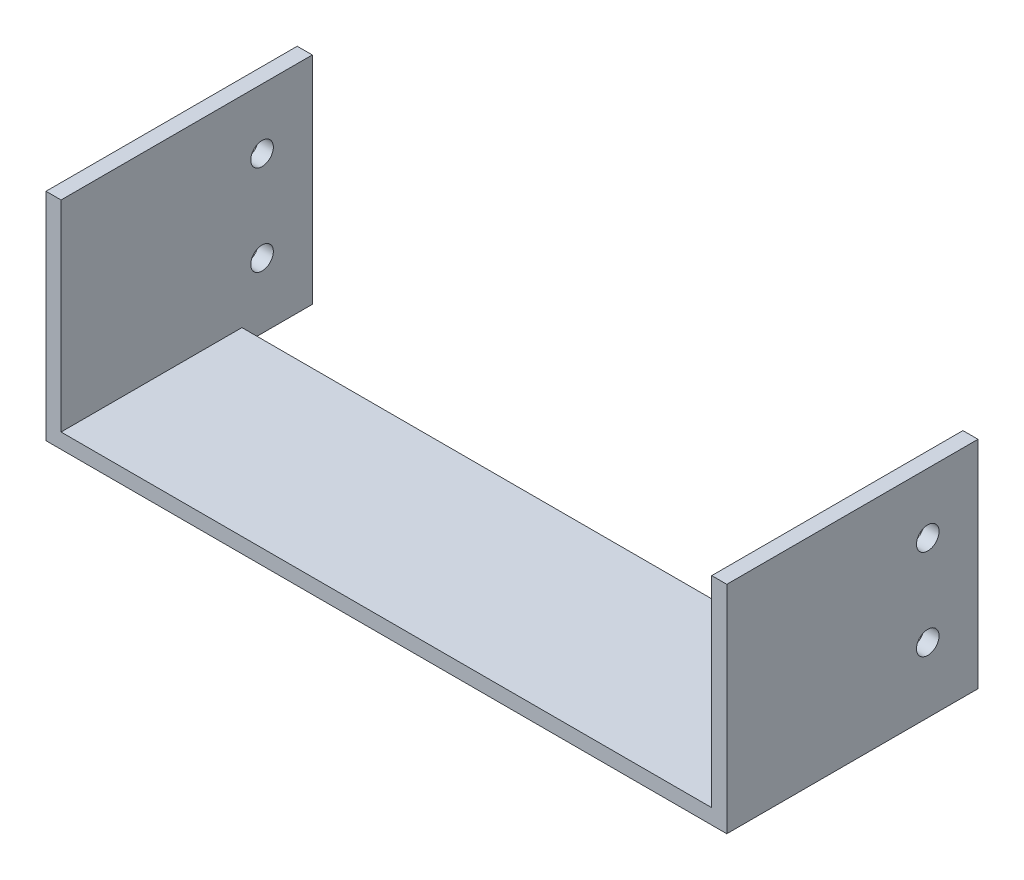
ISO-10303-21;
HEADER;
FILE_DESCRIPTION(('STEP AP214'),'2;1');
FILE_NAME('part.step','',(''),(''),'','','');
FILE_SCHEMA(('AUTOMOTIVE_DESIGN { 1 0 10303 214 1 1 1 1 }'));
ENDSEC;
DATA;
#1=APPLICATION_CONTEXT('core data for automotive mechanical design processes');
#2=APPLICATION_PROTOCOL_DEFINITION('international standard','automotive_design',2000,#1);
#3=PRODUCT_CONTEXT('',#1,'mechanical');
#4=PRODUCT('Part','Part','',(#3));
#5=PRODUCT_RELATED_PRODUCT_CATEGORY('part','',(#4));
#6=PRODUCT_DEFINITION_FORMATION('','',#4);
#7=PRODUCT_DEFINITION_CONTEXT('part definition',#1,'design');
#8=PRODUCT_DEFINITION('design','',#6,#7);
#9=PRODUCT_DEFINITION_SHAPE('','',#8);
#10=(LENGTH_UNIT() NAMED_UNIT(*) SI_UNIT(.MILLI.,.METRE.));
#11=(NAMED_UNIT(*) PLANE_ANGLE_UNIT() SI_UNIT($,.RADIAN.));
#12=(NAMED_UNIT(*) SI_UNIT($,.STERADIAN.) SOLID_ANGLE_UNIT());
#13=UNCERTAINTY_MEASURE_WITH_UNIT(LENGTH_MEASURE(1.E-05),#10,'distance_accuracy_value','');
#14=(GEOMETRIC_REPRESENTATION_CONTEXT(3) GLOBAL_UNCERTAINTY_ASSIGNED_CONTEXT((#13)) GLOBAL_UNIT_ASSIGNED_CONTEXT((#10,
#11,#12)) REPRESENTATION_CONTEXT('',''));
#15=CARTESIAN_POINT('',(0.,0.,0.));
#16=DIRECTION('',(0.,0.,1.));
#17=DIRECTION('',(1.,0.,0.));
#18=AXIS2_PLACEMENT_3D('',#15,#16,#17);
#19=CARTESIAN_POINT('',(129.5,3.,0.));
#20=DIRECTION('',(0.,0.,-1.));
#21=DIRECTION('',(-1.,0.,0.));
#22=AXIS2_PLACEMENT_3D('',#19,#20,#21);
#23=PLANE('',#22);
#24=DIRECTION('',(1.,0.,0.));
#25=VECTOR('',#24,1.);
#26=CARTESIAN_POINT('',(129.5,0.,0.));
#27=LINE('',#26,#25);
#28=CARTESIAN_POINT('',(-3.,0.,0.));
#29=VERTEX_POINT('',#28);
#30=CARTESIAN_POINT('',(132.5,0.,0.));
#31=VERTEX_POINT('',#30);
#32=EDGE_CURVE('E113',#29,#31,#27,.T.);
#33=ORIENTED_EDGE('',*,*,#32,.T.);
#34=DIRECTION('',(0.,-1.,0.));
#35=VECTOR('',#34,1.);
#36=CARTESIAN_POINT('',(132.5,0.,0.));
#37=LINE('',#36,#35);
#38=CARTESIAN_POINT('',(132.5,43.,0.));
#39=VERTEX_POINT('',#38);
#40=EDGE_CURVE('E182',#39,#31,#37,.T.);
#41=ORIENTED_EDGE('',*,*,#40,.F.);
#42=DIRECTION('',(-1.,0.,0.));
#43=VECTOR('',#42,1.);
#44=CARTESIAN_POINT('',(132.5,43.,0.));
#45=LINE('',#44,#43);
#46=CARTESIAN_POINT('',(129.5,43.,0.));
#47=VERTEX_POINT('',#46);
#48=EDGE_CURVE('E184',#39,#47,#45,.T.);
#49=ORIENTED_EDGE('',*,*,#48,.T.);
#50=DIRECTION('',(0.,-1.,0.));
#51=VECTOR('',#50,1.);
#52=CARTESIAN_POINT('',(129.5,0.,0.));
#53=LINE('',#52,#51);
#54=CARTESIAN_POINT('',(129.5,3.,0.));
#55=VERTEX_POINT('',#54);
#56=EDGE_CURVE('E178',#47,#55,#53,.T.);
#57=ORIENTED_EDGE('',*,*,#56,.T.);
#58=DIRECTION('',(1.,0.,0.));
#59=VECTOR('',#58,1.);
#60=CARTESIAN_POINT('',(129.5,3.,0.));
#61=LINE('',#60,#59);
#62=CARTESIAN_POINT('',(0.,3.,0.));
#63=VERTEX_POINT('',#62);
#64=EDGE_CURVE('E199',#63,#55,#61,.T.);
#65=ORIENTED_EDGE('',*,*,#64,.F.);
#66=DIRECTION('',(0.,-1.,0.));
#67=VECTOR('',#66,1.);
#68=CARTESIAN_POINT('',(0.,0.,0.));
#69=LINE('',#68,#67);
#70=CARTESIAN_POINT('',(0.,43.,0.));
#71=VERTEX_POINT('',#70);
#72=EDGE_CURVE('E150',#71,#63,#69,.T.);
#73=ORIENTED_EDGE('',*,*,#72,.F.);
#74=DIRECTION('',(1.,0.,0.));
#75=VECTOR('',#74,1.);
#76=CARTESIAN_POINT('',(-3.,43.,0.));
#77=LINE('',#76,#75);
#78=CARTESIAN_POINT('',(-3.,43.,0.));
#79=VERTEX_POINT('',#78);
#80=EDGE_CURVE('E140',#79,#71,#77,.T.);
#81=ORIENTED_EDGE('',*,*,#80,.F.);
#82=DIRECTION('',(0.,-1.,0.));
#83=VECTOR('',#82,1.);
#84=CARTESIAN_POINT('',(-3.,0.,0.));
#85=LINE('',#84,#83);
#86=EDGE_CURVE('E133',#79,#29,#85,.T.);
#87=ORIENTED_EDGE('',*,*,#86,.T.);
#88=EDGE_LOOP('',(#33,#41,#49,#57,#65,#73,#81,#87));
#89=FACE_BOUND('',#88,.T.);
#90=ADVANCED_FACE('F36',(#89),#23,.F.);
#91=CARTESIAN_POINT('',(0.,3.,-36.));
#92=DIRECTION('',(0.,0.,1.));
#93=DIRECTION('',(1.,0.,0.));
#94=AXIS2_PLACEMENT_3D('',#91,#92,#93);
#95=PLANE('',#94);
#96=DIRECTION('',(-1.,0.,0.));
#97=VECTOR('',#96,1.);
#98=CARTESIAN_POINT('',(0.,0.,-36.));
#99=LINE('',#98,#97);
#100=CARTESIAN_POINT('',(129.5,0.,-36.));
#101=VERTEX_POINT('',#100);
#102=CARTESIAN_POINT('',(0.,0.,-36.));
#103=VERTEX_POINT('',#102);
#104=EDGE_CURVE('E126',#101,#103,#99,.T.);
#105=ORIENTED_EDGE('',*,*,#104,.T.);
#106=DIRECTION('',(0.,-1.,0.));
#107=VECTOR('',#106,1.);
#108=CARTESIAN_POINT('',(0.,3.,-36.));
#109=LINE('',#108,#107);
#110=CARTESIAN_POINT('',(0.,3.,-36.));
#111=VERTEX_POINT('',#110);
#112=EDGE_CURVE('E43',#111,#103,#109,.T.);
#113=ORIENTED_EDGE('',*,*,#112,.F.);
#114=DIRECTION('',(-1.,0.,0.));
#115=VECTOR('',#114,1.);
#116=CARTESIAN_POINT('',(0.,3.,-36.));
#117=LINE('',#116,#115);
#118=CARTESIAN_POINT('',(129.5,3.,-36.));
#119=VERTEX_POINT('',#118);
#120=EDGE_CURVE('E55',#119,#111,#117,.T.);
#121=ORIENTED_EDGE('',*,*,#120,.F.);
#122=DIRECTION('',(0.,-1.,0.));
#123=VECTOR('',#122,1.);
#124=CARTESIAN_POINT('',(129.5,3.,-36.));
#125=LINE('',#124,#123);
#126=EDGE_CURVE('E11',#119,#101,#125,.T.);
#127=ORIENTED_EDGE('',*,*,#126,.T.);
#128=EDGE_LOOP('',(#105,#113,#121,#127));
#129=FACE_BOUND('',#128,.T.);
#130=ADVANCED_FACE('F220',(#129),#95,.F.);
#131=CARTESIAN_POINT('',(0.,3.,0.));
#132=DIRECTION('',(0.,-1.,0.));
#133=DIRECTION('',(0.,0.,-1.));
#134=AXIS2_PLACEMENT_3D('',#131,#132,#133);
#135=PLANE('',#134);
#136=ORIENTED_EDGE('',*,*,#64,.T.);
#137=DIRECTION('',(0.,0.,-1.));
#138=VECTOR('',#137,1.);
#139=CARTESIAN_POINT('',(129.5,3.,-36.));
#140=LINE('',#139,#138);
#141=EDGE_CURVE('E201',#55,#119,#140,.T.);
#142=ORIENTED_EDGE('',*,*,#141,.T.);
#143=ORIENTED_EDGE('',*,*,#120,.T.);
#144=DIRECTION('',(0.,0.,1.));
#145=VECTOR('',#144,1.);
#146=CARTESIAN_POINT('',(0.,3.,0.));
#147=LINE('',#146,#145);
#148=EDGE_CURVE('E50',#111,#63,#147,.T.);
#149=ORIENTED_EDGE('',*,*,#148,.T.);
#150=EDGE_LOOP('',(#136,#142,#143,#149));
#151=FACE_BOUND('',#150,.T.);
#152=ADVANCED_FACE('F218',(#151),#135,.F.);
#153=CARTESIAN_POINT('',(0.,0.,0.));
#154=DIRECTION('',(0.,-1.,0.));
#155=DIRECTION('',(0.,0.,-1.));
#156=AXIS2_PLACEMENT_3D('',#153,#154,#155);
#157=PLANE('',#156);
#158=ORIENTED_EDGE('',*,*,#32,.F.);
#159=DIRECTION('',(0.,0.,-1.));
#160=VECTOR('',#159,1.);
#161=CARTESIAN_POINT('',(-3.,0.,0.));
#162=LINE('',#161,#160);
#163=CARTESIAN_POINT('',(-3.,0.,-50.));
#164=VERTEX_POINT('',#163);
#165=EDGE_CURVE('E117',#29,#164,#162,.T.);
#166=ORIENTED_EDGE('',*,*,#165,.T.);
#167=DIRECTION('',(1.,0.,0.));
#168=VECTOR('',#167,1.);
#169=CARTESIAN_POINT('',(-3.,0.,-50.));
#170=LINE('',#169,#168);
#171=CARTESIAN_POINT('',(0.,0.,-50.));
#172=VERTEX_POINT('',#171);
#173=EDGE_CURVE('E147',#164,#172,#170,.T.);
#174=ORIENTED_EDGE('',*,*,#173,.T.);
#175=DIRECTION('',(0.,0.,-1.));
#176=VECTOR('',#175,1.);
#177=CARTESIAN_POINT('',(0.,0.,0.));
#178=LINE('',#177,#176);
#179=EDGE_CURVE('E148',#103,#172,#178,.T.);
#180=ORIENTED_EDGE('',*,*,#179,.F.);
#181=ORIENTED_EDGE('',*,*,#104,.F.);
#182=DIRECTION('',(0.,0.,-1.));
#183=VECTOR('',#182,1.);
#184=CARTESIAN_POINT('',(129.5,0.,0.));
#185=LINE('',#184,#183);
#186=CARTESIAN_POINT('',(129.5,0.,-50.));
#187=VERTEX_POINT('',#186);
#188=EDGE_CURVE('E173',#101,#187,#185,.T.);
#189=ORIENTED_EDGE('',*,*,#188,.T.);
#190=DIRECTION('',(-1.,0.,0.));
#191=VECTOR('',#190,1.);
#192=CARTESIAN_POINT('',(132.5,0.,-50.));
#193=LINE('',#192,#191);
#194=CARTESIAN_POINT('',(132.5,0.,-50.));
#195=VERTEX_POINT('',#194);
#196=EDGE_CURVE('E127',#195,#187,#193,.T.);
#197=ORIENTED_EDGE('',*,*,#196,.F.);
#198=DIRECTION('',(0.,0.,-1.));
#199=VECTOR('',#198,1.);
#200=CARTESIAN_POINT('',(132.5,0.,0.));
#201=LINE('',#200,#199);
#202=EDGE_CURVE('E121',#31,#195,#201,.T.);
#203=ORIENTED_EDGE('',*,*,#202,.F.);
#204=EDGE_LOOP('',(#158,#166,#174,#180,#181,#189,#197,#203));
#205=FACE_BOUND('',#204,.T.);
#206=ADVANCED_FACE('F115',(#205),#157,.T.);
#207=CARTESIAN_POINT('',(129.5,0.,0.));
#208=DIRECTION('',(-1.,0.,0.));
#209=DIRECTION('',(0.,0.,1.));
#210=AXIS2_PLACEMENT_3D('',#207,#208,#209);
#211=PLANE('',#210);
#212=CARTESIAN_POINT('',(129.5,13.,-40.));
#213=DIRECTION('',(1.,0.,0.));
#214=DIRECTION('',(0.,0.,-1.));
#215=AXIS2_PLACEMENT_3D('',#212,#213,#214);
#216=CIRCLE('',#215,2.25);
#217=CARTESIAN_POINT('',(129.5,13.,-42.25));
#218=VERTEX_POINT('',#217);
#219=EDGE_CURVE('E163',#218,#218,#216,.T.);
#220=ORIENTED_EDGE('',*,*,#219,.T.);
#221=EDGE_LOOP('',(#220));
#222=FACE_BOUND('',#221,.T.);
#223=CARTESIAN_POINT('',(129.5,31.,-40.));
#224=DIRECTION('',(1.,0.,0.));
#225=DIRECTION('',(0.,0.,-1.));
#226=AXIS2_PLACEMENT_3D('',#223,#224,#225);
#227=CIRCLE('',#226,2.25);
#228=CARTESIAN_POINT('',(129.5,31.,-42.25));
#229=VERTEX_POINT('',#228);
#230=EDGE_CURVE('E167',#229,#229,#227,.T.);
#231=ORIENTED_EDGE('',*,*,#230,.T.);
#232=EDGE_LOOP('',(#231));
#233=FACE_BOUND('',#232,.T.);
#234=ORIENTED_EDGE('',*,*,#126,.F.);
#235=ORIENTED_EDGE('',*,*,#141,.F.);
#236=ORIENTED_EDGE('',*,*,#56,.F.);
#237=DIRECTION('',(0.,0.,1.));
#238=VECTOR('',#237,1.);
#239=CARTESIAN_POINT('',(129.5,43.,0.));
#240=LINE('',#239,#238);
#241=CARTESIAN_POINT('',(129.5,43.,-50.));
#242=VERTEX_POINT('',#241);
#243=EDGE_CURVE('E188',#242,#47,#240,.T.);
#244=ORIENTED_EDGE('',*,*,#243,.F.);
#245=DIRECTION('',(0.,1.,0.));
#246=VECTOR('',#245,1.);
#247=CARTESIAN_POINT('',(129.5,43.,-50.));
#248=LINE('',#247,#246);
#249=EDGE_CURVE('E186',#187,#242,#248,.T.);
#250=ORIENTED_EDGE('',*,*,#249,.F.);
#251=ORIENTED_EDGE('',*,*,#188,.F.);
#252=EDGE_LOOP('',(#234,#235,#236,#244,#250,#251));
#253=FACE_BOUND('',#252,.T.);
#254=ADVANCED_FACE('F221',(#222,#233,#253),#211,.T.);
#255=CARTESIAN_POINT('',(132.5,0.,0.));
#256=DIRECTION('',(-1.,0.,0.));
#257=DIRECTION('',(0.,0.,1.));
#258=AXIS2_PLACEMENT_3D('',#255,#256,#257);
#259=PLANE('',#258);
#260=ORIENTED_EDGE('',*,*,#202,.T.);
#261=DIRECTION('',(0.,1.,0.));
#262=VECTOR('',#261,1.);
#263=CARTESIAN_POINT('',(132.5,43.,-50.));
#264=LINE('',#263,#262);
#265=CARTESIAN_POINT('',(132.5,43.,-50.));
#266=VERTEX_POINT('',#265);
#267=EDGE_CURVE('E177',#195,#266,#264,.T.);
#268=ORIENTED_EDGE('',*,*,#267,.T.);
#269=DIRECTION('',(0.,0.,1.));
#270=VECTOR('',#269,1.);
#271=CARTESIAN_POINT('',(132.5,43.,0.));
#272=LINE('',#271,#270);
#273=EDGE_CURVE('E180',#266,#39,#272,.T.);
#274=ORIENTED_EDGE('',*,*,#273,.T.);
#275=ORIENTED_EDGE('',*,*,#40,.T.);
#276=EDGE_LOOP('',(#260,#268,#274,#275));
#277=FACE_BOUND('',#276,.T.);
#278=CARTESIAN_POINT('',(132.5,31.,-40.));
#279=DIRECTION('',(1.,0.,0.));
#280=DIRECTION('',(0.,0.,-1.));
#281=AXIS2_PLACEMENT_3D('',#278,#279,#280);
#282=CIRCLE('',#281,2.25);
#283=CARTESIAN_POINT('',(132.5,31.,-42.25));
#284=VERTEX_POINT('',#283);
#285=EDGE_CURVE('E170',#284,#284,#282,.T.);
#286=ORIENTED_EDGE('',*,*,#285,.F.);
#287=EDGE_LOOP('',(#286));
#288=FACE_BOUND('',#287,.T.);
#289=CARTESIAN_POINT('',(132.5,13.,-40.));
#290=DIRECTION('',(1.,0.,0.));
#291=DIRECTION('',(0.,0.,-1.));
#292=AXIS2_PLACEMENT_3D('',#289,#290,#291);
#293=CIRCLE('',#292,2.25);
#294=CARTESIAN_POINT('',(132.5,13.,-42.25));
#295=VERTEX_POINT('',#294);
#296=EDGE_CURVE('E164',#295,#295,#293,.T.);
#297=ORIENTED_EDGE('',*,*,#296,.F.);
#298=EDGE_LOOP('',(#297));
#299=FACE_BOUND('',#298,.T.);
#300=ADVANCED_FACE('F229',(#277,#288,#299),#259,.F.);
#301=CARTESIAN_POINT('',(132.5,43.,-50.));
#302=DIRECTION('',(0.,0.,1.));
#303=DIRECTION('',(0.,-1.,0.));
#304=AXIS2_PLACEMENT_3D('',#301,#302,#303);
#305=PLANE('',#304);
#306=ORIENTED_EDGE('',*,*,#249,.T.);
#307=DIRECTION('',(-1.,0.,0.));
#308=VECTOR('',#307,1.);
#309=CARTESIAN_POINT('',(132.5,43.,-50.));
#310=LINE('',#309,#308);
#311=EDGE_CURVE('E194',#266,#242,#310,.T.);
#312=ORIENTED_EDGE('',*,*,#311,.F.);
#313=ORIENTED_EDGE('',*,*,#267,.F.);
#314=ORIENTED_EDGE('',*,*,#196,.T.);
#315=EDGE_LOOP('',(#306,#312,#313,#314));
#316=FACE_BOUND('',#315,.T.);
#317=ADVANCED_FACE('F225',(#316),#305,.F.);
#318=CARTESIAN_POINT('',(132.5,43.,0.));
#319=DIRECTION('',(0.,-1.,0.));
#320=DIRECTION('',(0.,0.,-1.));
#321=AXIS2_PLACEMENT_3D('',#318,#319,#320);
#322=PLANE('',#321);
#323=ORIENTED_EDGE('',*,*,#243,.T.);
#324=ORIENTED_EDGE('',*,*,#48,.F.);
#325=ORIENTED_EDGE('',*,*,#273,.F.);
#326=ORIENTED_EDGE('',*,*,#311,.T.);
#327=EDGE_LOOP('',(#323,#324,#325,#326));
#328=FACE_BOUND('',#327,.T.);
#329=ADVANCED_FACE('F233',(#328),#322,.F.);
#330=CARTESIAN_POINT('',(132.5,31.,-40.));
#331=DIRECTION('',(-1.,0.,0.));
#332=DIRECTION('',(0.,0.,1.));
#333=AXIS2_PLACEMENT_3D('',#330,#331,#332);
#334=CYLINDRICAL_SURFACE('',#333,2.25);
#335=ORIENTED_EDGE('',*,*,#285,.T.);
#336=EDGE_LOOP('',(#335));
#337=FACE_BOUND('',#336,.T.);
#338=ORIENTED_EDGE('',*,*,#230,.F.);
#339=EDGE_LOOP('',(#338));
#340=FACE_BOUND('',#339,.T.);
#341=ADVANCED_FACE('F235',(#337,#340),#334,.F.);
#342=CARTESIAN_POINT('',(132.5,13.,-40.));
#343=DIRECTION('',(-1.,0.,0.));
#344=DIRECTION('',(0.,0.,1.));
#345=AXIS2_PLACEMENT_3D('',#342,#343,#344);
#346=CYLINDRICAL_SURFACE('',#345,2.25);
#347=ORIENTED_EDGE('',*,*,#296,.T.);
#348=EDGE_LOOP('',(#347));
#349=FACE_BOUND('',#348,.T.);
#350=ORIENTED_EDGE('',*,*,#219,.F.);
#351=EDGE_LOOP('',(#350));
#352=FACE_BOUND('',#351,.T.);
#353=ADVANCED_FACE('F241',(#349,#352),#346,.F.);
#354=CARTESIAN_POINT('',(0.,0.,0.));
#355=DIRECTION('',(1.,0.,0.));
#356=DIRECTION('',(0.,0.,1.));
#357=AXIS2_PLACEMENT_3D('',#354,#355,#356);
#358=PLANE('',#357);
#359=CARTESIAN_POINT('',(0.,31.,-40.));
#360=DIRECTION('',(1.,0.,0.));
#361=DIRECTION('',(0.,0.,-1.));
#362=AXIS2_PLACEMENT_3D('',#359,#360,#361);
#363=CIRCLE('',#362,2.25);
#364=CARTESIAN_POINT('',(0.,31.,-42.25));
#365=VERTEX_POINT('',#364);
#366=EDGE_CURVE('E297',#365,#365,#363,.T.);
#367=ORIENTED_EDGE('',*,*,#366,.F.);
#368=EDGE_LOOP('',(#367));
#369=FACE_BOUND('',#368,.T.);
#370=CARTESIAN_POINT('',(0.,13.,-40.));
#371=DIRECTION('',(1.,0.,0.));
#372=DIRECTION('',(0.,0.,-1.));
#373=AXIS2_PLACEMENT_3D('',#370,#371,#372);
#374=CIRCLE('',#373,2.25);
#375=CARTESIAN_POINT('',(0.,13.,-42.25));
#376=VERTEX_POINT('',#375);
#377=EDGE_CURVE('E294',#376,#376,#374,.T.);
#378=ORIENTED_EDGE('',*,*,#377,.F.);
#379=EDGE_LOOP('',(#378));
#380=FACE_BOUND('',#379,.T.);
#381=ORIENTED_EDGE('',*,*,#148,.F.);
#382=ORIENTED_EDGE('',*,*,#112,.T.);
#383=ORIENTED_EDGE('',*,*,#179,.T.);
#384=DIRECTION('',(0.,1.,0.));
#385=VECTOR('',#384,1.);
#386=CARTESIAN_POINT('',(0.,43.,-50.));
#387=LINE('',#386,#385);
#388=CARTESIAN_POINT('',(0.,43.,-50.));
#389=VERTEX_POINT('',#388);
#390=EDGE_CURVE('E137',#172,#389,#387,.T.);
#391=ORIENTED_EDGE('',*,*,#390,.T.);
#392=DIRECTION('',(0.,0.,1.));
#393=VECTOR('',#392,1.);
#394=CARTESIAN_POINT('',(0.,43.,0.));
#395=LINE('',#394,#393);
#396=EDGE_CURVE('E154',#389,#71,#395,.T.);
#397=ORIENTED_EDGE('',*,*,#396,.T.);
#398=ORIENTED_EDGE('',*,*,#72,.T.);
#399=EDGE_LOOP('',(#381,#382,#383,#391,#397,#398));
#400=FACE_BOUND('',#399,.T.);
#401=ADVANCED_FACE('F208',(#369,#380,#400),#358,.T.);
#402=CARTESIAN_POINT('',(-3.,43.,0.));
#403=DIRECTION('',(0.,1.,0.));
#404=DIRECTION('',(0.,0.,1.));
#405=AXIS2_PLACEMENT_3D('',#402,#403,#404);
#406=PLANE('',#405);
#407=ORIENTED_EDGE('',*,*,#396,.F.);
#408=DIRECTION('',(1.,0.,0.));
#409=VECTOR('',#408,1.);
#410=CARTESIAN_POINT('',(-3.,43.,-50.));
#411=LINE('',#410,#409);
#412=CARTESIAN_POINT('',(-3.,43.,-50.));
#413=VERTEX_POINT('',#412);
#414=EDGE_CURVE('E160',#413,#389,#411,.T.);
#415=ORIENTED_EDGE('',*,*,#414,.F.);
#416=DIRECTION('',(0.,0.,1.));
#417=VECTOR('',#416,1.);
#418=CARTESIAN_POINT('',(-3.,43.,0.));
#419=LINE('',#418,#417);
#420=EDGE_CURVE('E141',#413,#79,#419,.T.);
#421=ORIENTED_EDGE('',*,*,#420,.T.);
#422=ORIENTED_EDGE('',*,*,#80,.T.);
#423=EDGE_LOOP('',(#407,#415,#421,#422));
#424=FACE_BOUND('',#423,.T.);
#425=ADVANCED_FACE('F216',(#424),#406,.T.);
#426=CARTESIAN_POINT('',(-3.,43.,-50.));
#427=DIRECTION('',(0.,0.,-1.));
#428=DIRECTION('',(0.,1.,0.));
#429=AXIS2_PLACEMENT_3D('',#426,#427,#428);
#430=PLANE('',#429);
#431=ORIENTED_EDGE('',*,*,#390,.F.);
#432=ORIENTED_EDGE('',*,*,#173,.F.);
#433=DIRECTION('',(0.,1.,0.));
#434=VECTOR('',#433,1.);
#435=CARTESIAN_POINT('',(-3.,43.,-50.));
#436=LINE('',#435,#434);
#437=EDGE_CURVE('E136',#164,#413,#436,.T.);
#438=ORIENTED_EDGE('',*,*,#437,.T.);
#439=ORIENTED_EDGE('',*,*,#414,.T.);
#440=EDGE_LOOP('',(#431,#432,#438,#439));
#441=FACE_BOUND('',#440,.T.);
#442=ADVANCED_FACE('F213',(#441),#430,.T.);
#443=CARTESIAN_POINT('',(-3.,0.,0.));
#444=DIRECTION('',(1.,0.,0.));
#445=DIRECTION('',(0.,0.,1.));
#446=AXIS2_PLACEMENT_3D('',#443,#444,#445);
#447=PLANE('',#446);
#448=CARTESIAN_POINT('',(-3.,13.,-40.));
#449=DIRECTION('',(1.,0.,0.));
#450=DIRECTION('',(0.,0.,-1.));
#451=AXIS2_PLACEMENT_3D('',#448,#449,#450);
#452=CIRCLE('',#451,2.25);
#453=CARTESIAN_POINT('',(-3.,13.,-42.25));
#454=VERTEX_POINT('',#453);
#455=EDGE_CURVE('E291',#454,#454,#452,.T.);
#456=ORIENTED_EDGE('',*,*,#455,.T.);
#457=EDGE_LOOP('',(#456));
#458=FACE_BOUND('',#457,.T.);
#459=CARTESIAN_POINT('',(-3.,31.,-40.));
#460=DIRECTION('',(1.,0.,0.));
#461=DIRECTION('',(0.,0.,-1.));
#462=AXIS2_PLACEMENT_3D('',#459,#460,#461);
#463=CIRCLE('',#462,2.25);
#464=CARTESIAN_POINT('',(-3.,31.,-42.25));
#465=VERTEX_POINT('',#464);
#466=EDGE_CURVE('E151',#465,#465,#463,.T.);
#467=ORIENTED_EDGE('',*,*,#466,.T.);
#468=EDGE_LOOP('',(#467));
#469=FACE_BOUND('',#468,.T.);
#470=ORIENTED_EDGE('',*,*,#165,.F.);
#471=ORIENTED_EDGE('',*,*,#86,.F.);
#472=ORIENTED_EDGE('',*,*,#420,.F.);
#473=ORIENTED_EDGE('',*,*,#437,.F.);
#474=EDGE_LOOP('',(#470,#471,#472,#473));
#475=FACE_BOUND('',#474,.T.);
#476=ADVANCED_FACE('F131',(#458,#469,#475),#447,.F.);
#477=CARTESIAN_POINT('',(-3.,31.,-40.));
#478=DIRECTION('',(1.,0.,0.));
#479=DIRECTION('',(0.,0.,-1.));
#480=AXIS2_PLACEMENT_3D('',#477,#478,#479);
#481=CYLINDRICAL_SURFACE('',#480,2.25);
#482=ORIENTED_EDGE('',*,*,#466,.F.);
#483=EDGE_LOOP('',(#482));
#484=FACE_BOUND('',#483,.T.);
#485=ORIENTED_EDGE('',*,*,#366,.T.);
#486=EDGE_LOOP('',(#485));
#487=FACE_BOUND('',#486,.T.);
#488=ADVANCED_FACE('F278',(#484,#487),#481,.F.);
#489=CARTESIAN_POINT('',(-3.,13.,-40.));
#490=DIRECTION('',(1.,0.,0.));
#491=DIRECTION('',(0.,0.,-1.));
#492=AXIS2_PLACEMENT_3D('',#489,#490,#491);
#493=CYLINDRICAL_SURFACE('',#492,2.25);
#494=ORIENTED_EDGE('',*,*,#455,.F.);
#495=EDGE_LOOP('',(#494));
#496=FACE_BOUND('',#495,.T.);
#497=ORIENTED_EDGE('',*,*,#377,.T.);
#498=EDGE_LOOP('',(#497));
#499=FACE_BOUND('',#498,.T.);
#500=ADVANCED_FACE('F282',(#496,#499),#493,.F.);
#501=CLOSED_SHELL('',(#90,#130,#152,#206,#254,#300,#317,#329,#341,#353,#401,#425,#442,#476,#488,#500));
#502=MANIFOLD_SOLID_BREP('B2',#501);
#503=ADVANCED_BREP_SHAPE_REPRESENTATION('',(#18,#502),#14);
#504=SHAPE_DEFINITION_REPRESENTATION(#9,#503);
ENDSEC;
END-ISO-10303-21;
